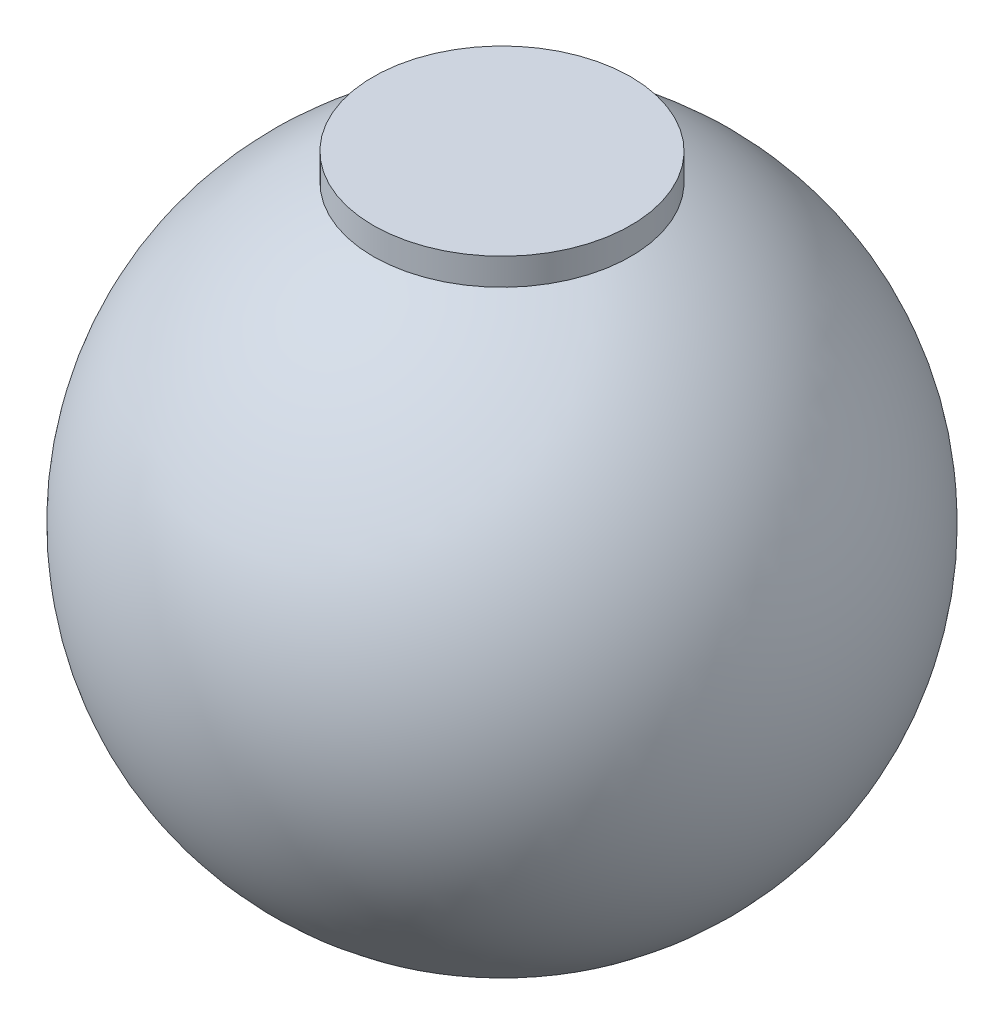
ISO-10303-21;
HEADER;
FILE_DESCRIPTION(('STEP AP214'),'2;1');
FILE_NAME('part.step','',(''),(''),'','','');
FILE_SCHEMA(('AUTOMOTIVE_DESIGN { 1 0 10303 214 1 1 1 1 }'));
ENDSEC;
DATA;
#1=APPLICATION_CONTEXT('core data for automotive mechanical design processes');
#2=APPLICATION_PROTOCOL_DEFINITION('international standard','automotive_design',2000,#1);
#3=PRODUCT_CONTEXT('',#1,'mechanical');
#4=PRODUCT('Part','Part','',(#3));
#5=PRODUCT_RELATED_PRODUCT_CATEGORY('part','',(#4));
#6=PRODUCT_DEFINITION_FORMATION('','',#4);
#7=PRODUCT_DEFINITION_CONTEXT('part definition',#1,'design');
#8=PRODUCT_DEFINITION('design','',#6,#7);
#9=PRODUCT_DEFINITION_SHAPE('','',#8);
#10=(LENGTH_UNIT() NAMED_UNIT(*) SI_UNIT(.MILLI.,.METRE.));
#11=(NAMED_UNIT(*) PLANE_ANGLE_UNIT() SI_UNIT($,.RADIAN.));
#12=(NAMED_UNIT(*) SI_UNIT($,.STERADIAN.) SOLID_ANGLE_UNIT());
#13=UNCERTAINTY_MEASURE_WITH_UNIT(LENGTH_MEASURE(1.E-05),#10,'distance_accuracy_value','');
#14=(GEOMETRIC_REPRESENTATION_CONTEXT(3) GLOBAL_UNCERTAINTY_ASSIGNED_CONTEXT((#13)) GLOBAL_UNIT_ASSIGNED_CONTEXT((#10,
#11,#12)) REPRESENTATION_CONTEXT('',''));
#15=CARTESIAN_POINT('',(0.,0.,0.));
#16=DIRECTION('',(0.,0.,1.));
#17=DIRECTION('',(1.,0.,0.));
#18=AXIS2_PLACEMENT_3D('',#15,#16,#17);
#19=CARTESIAN_POINT('',(0.,0.,100.));
#20=DIRECTION('',(0.,0.,-1.));
#21=DIRECTION('',(-1.,0.,0.));
#22=AXIS2_PLACEMENT_3D('',#19,#20,#21);
#23=SPHERICAL_SURFACE('',#22,100.);
#24=CARTESIAN_POINT('',(0.,0.,100.));
#25=DIRECTION('',(0.,-1.,0.));
#26=DIRECTION('',(0.,0.,-1.));
#27=AXIS2_PLACEMENT_3D('',#24,#25,#26);
#28=SPHERICAL_SURFACE('',#27,100.);
#29=CARTESIAN_POINT('',(0.,91.6515138991168,100.));
#30=DIRECTION('',(0.,-1.,0.));
#31=DIRECTION('',(0.,0.,-1.));
#32=AXIS2_PLACEMENT_3D('',#29,#30,#31);
#33=CIRCLE('',#32,40.);
#34=CARTESIAN_POINT('',(0.,91.6515138991168,60.));
#35=VERTEX_POINT('',#34);
#36=EDGE_CURVE('E11',#35,#35,#33,.F.);
#37=ORIENTED_EDGE('',*,*,#36,.F.);
#38=EDGE_LOOP('',(#37));
#39=FACE_BOUND('',#38,.T.);
#40=ADVANCED_FACE('F33',(#39),#28,.T.);
#41=CARTESIAN_POINT('',(0.,100.,100.));
#42=DIRECTION('',(0.,-1.,0.));
#43=DIRECTION('',(0.,0.,-1.));
#44=AXIS2_PLACEMENT_3D('',#41,#42,#43);
#45=CYLINDRICAL_SURFACE('',#44,40.);
#46=CARTESIAN_POINT('',(0.,100.,100.));
#47=DIRECTION('',(0.,1.,0.));
#48=DIRECTION('',(0.,0.,1.));
#49=AXIS2_PLACEMENT_3D('',#46,#47,#48);
#50=CIRCLE('',#49,40.);
#51=CARTESIAN_POINT('',(0.,100.,60.));
#52=VERTEX_POINT('',#51);
#53=EDGE_CURVE('E39',#52,#52,#50,.T.);
#54=CARTESIAN_POINT('',(0.,100.,60.));
#55=CARTESIAN_POINT('',(0.,99.9130366031158,60.));
#56=CARTESIAN_POINT('',(0.,99.8260732062316,60.));
#57=CARTESIAN_POINT('',(0.,99.6521464124632,60.));
#58=CARTESIAN_POINT('',(0.,99.565183015579,60.));
#59=CARTESIAN_POINT('',(0.,99.3912562218106,60.));
#60=CARTESIAN_POINT('',(0.,99.3042928249264,60.));
#61=CARTESIAN_POINT('',(0.,99.130366031158,60.));
#62=CARTESIAN_POINT('',(0.,99.0434026342738,60.));
#63=CARTESIAN_POINT('',(0.,98.8694758405054,60.));
#64=CARTESIAN_POINT('',(0.,98.7825124436212,60.));
#65=CARTESIAN_POINT('',(0.,98.6085856498528,60.));
#66=CARTESIAN_POINT('',(0.,98.5216222529686,60.));
#67=CARTESIAN_POINT('',(0.,98.3476954592002,60.));
#68=CARTESIAN_POINT('',(0.,98.260732062316,60.));
#69=CARTESIAN_POINT('',(0.,98.0868052685476,60.));
#70=CARTESIAN_POINT('',(0.,97.9998418716634,60.));
#71=CARTESIAN_POINT('',(0.,97.825915077895,60.));
#72=CARTESIAN_POINT('',(0.,97.7389516810108,60.));
#73=CARTESIAN_POINT('',(0.,97.5650248872424,60.));
#74=CARTESIAN_POINT('',(0.,97.4780614903582,60.));
#75=CARTESIAN_POINT('',(0.,97.3041346965898,60.));
#76=CARTESIAN_POINT('',(0.,97.2171712997056,60.));
#77=CARTESIAN_POINT('',(0.,97.0432445059372,60.));
#78=CARTESIAN_POINT('',(0.,96.956281109053,60.));
#79=CARTESIAN_POINT('',(0.,96.7823543152846,60.));
#80=CARTESIAN_POINT('',(0.,96.6953909184004,60.));
#81=CARTESIAN_POINT('',(0.,96.521464124632,60.));
#82=CARTESIAN_POINT('',(0.,96.4345007277478,60.));
#83=CARTESIAN_POINT('',(0.,96.2605739339794,60.));
#84=CARTESIAN_POINT('',(0.,96.1736105370952,60.));
#85=CARTESIAN_POINT('',(0.,95.9996837433268,60.));
#86=CARTESIAN_POINT('',(0.,95.9127203464426,60.));
#87=CARTESIAN_POINT('',(0.,95.7387935526742,60.));
#88=CARTESIAN_POINT('',(0.,95.65183015579,60.));
#89=CARTESIAN_POINT('',(0.,95.4779033620216,60.));
#90=CARTESIAN_POINT('',(0.,95.3909399651374,60.));
#91=CARTESIAN_POINT('',(0.,95.217013171369,60.));
#92=CARTESIAN_POINT('',(0.,95.1300497744848,60.));
#93=CARTESIAN_POINT('',(0.,94.9561229807164,60.));
#94=CARTESIAN_POINT('',(0.,94.8691595838322,60.));
#95=CARTESIAN_POINT('',(0.,94.6952327900638,60.));
#96=CARTESIAN_POINT('',(0.,94.6082693931796,60.));
#97=CARTESIAN_POINT('',(0.,94.4343425994112,60.));
#98=CARTESIAN_POINT('',(0.,94.347379202527,60.));
#99=CARTESIAN_POINT('',(0.,94.1734524087586,60.));
#100=CARTESIAN_POINT('',(0.,94.0864890118744,60.));
#101=CARTESIAN_POINT('',(0.,93.912562218106,60.));
#102=CARTESIAN_POINT('',(0.,93.8255988212218,60.));
#103=CARTESIAN_POINT('',(0.,93.6516720274534,60.));
#104=CARTESIAN_POINT('',(0.,93.5647086305692,60.));
#105=CARTESIAN_POINT('',(0.,93.3907818368008,60.));
#106=CARTESIAN_POINT('',(0.,93.3038184399166,60.));
#107=CARTESIAN_POINT('',(0.,93.1298916461482,60.));
#108=CARTESIAN_POINT('',(0.,93.042928249264,60.));
#109=CARTESIAN_POINT('',(0.,92.8690014554956,60.));
#110=CARTESIAN_POINT('',(0.,92.7820380586114,60.));
#111=CARTESIAN_POINT('',(0.,92.608111264843,60.));
#112=CARTESIAN_POINT('',(0.,92.5211478679588,60.));
#113=CARTESIAN_POINT('',(0.,92.3472210741904,60.));
#114=CARTESIAN_POINT('',(0.,92.2602576773062,60.));
#115=CARTESIAN_POINT('',(0.,92.0863308835378,60.));
#116=CARTESIAN_POINT('',(0.,91.9993674866536,60.));
#117=CARTESIAN_POINT('',(0.,91.8254406928852,60.));
#118=CARTESIAN_POINT('',(0.,91.738477296001,60.));
#119=CARTESIAN_POINT('',(0.,91.6515138991168,60.));
#120=B_SPLINE_CURVE_WITH_KNOTS('',3,(#54,#55,#56,#57,#58,#59,#60,#61,#62,#63,#64,#65,#66,#67,
#68,#69,#70,#71,#72,#73,#74,#75,#76,#77,#78,#79,#80,#81,#82,#83,#84,#85,#86,#87,#88,#89,#90,#91,
#92,#93,#94,#95,#96,#97,#98,#99,#100,#101,#102,#103,#104,#105,#106,#107,#108,#109,#110,#111,
#112,#113,#114,#115,#116,#117,#118,#119),.UNSPECIFIED.,.F.,.F.,(4,2,2,2,2,2,2,2,2,2,2,2,2,2,2,2,
2,2,2,2,2,2,2,2,2,2,2,2,2,2,2,2,4),(0.,0.260890190652591,0.521780381305195,0.782670571957786,
1.04356076261039,1.30445095326298,1.56534114391559,1.82623133456818,2.08712152522078,
2.34801171587339,2.60890190652598,2.86979209717858,3.13068228783117,3.39157247848378,
3.65246266913637,3.91335285978897,4.17424305044156,4.43513324109417,4.69602343174677,
4.95691362239936,5.21780381305197,5.47869400370456,5.73958419435716,6.00047438500975,
6.26136457566236,6.52225476631496,6.78314495696755,7.04403514762016,7.30492533827275,
7.56581552892535,7.82670571957794,8.08759591023055,8.34848610088314),.UNSPECIFIED.);
#121=EDGE_CURVE('BSEAM45',#52,#35,#120,.T.);
#122=ORIENTED_EDGE('',*,*,#53,.F.);
#123=ORIENTED_EDGE('',*,*,#36,.T.);
#124=ORIENTED_EDGE('',*,*,#121,.T.);
#125=ORIENTED_EDGE('',*,*,#121,.F.);
#126=EDGE_LOOP('',(#122,#124,#123,#125));
#127=FACE_BOUND('',#126,.T.);
#128=ADVANCED_FACE('F45',(#127),#45,.T.);
#129=CARTESIAN_POINT('',(0.,100.,100.));
#130=DIRECTION('',(0.,1.,0.));
#131=DIRECTION('',(0.,0.,1.));
#132=AXIS2_PLACEMENT_3D('',#129,#130,#131);
#133=PLANE('',#132);
#134=CARTESIAN_POINT('',(0.,100.,100.));
#135=VERTEX_POINT('',#134);
#136=VERTEX_LOOP('',#135);
#137=FACE_BOUND('',#136,.T.);
#138=ORIENTED_EDGE('',*,*,#53,.T.);
#139=EDGE_LOOP('',(#138));
#140=FACE_BOUND('',#139,.T.);
#141=ADVANCED_FACE('F42',(#137,#140),#133,.T.);
#142=CLOSED_SHELL('',(#40,#128,#141));
#143=MANIFOLD_SOLID_BREP('B2',#142);
#144=ADVANCED_BREP_SHAPE_REPRESENTATION('',(#18,#143),#14);
#145=SHAPE_DEFINITION_REPRESENTATION(#9,#144);
ENDSEC;
END-ISO-10303-21;
